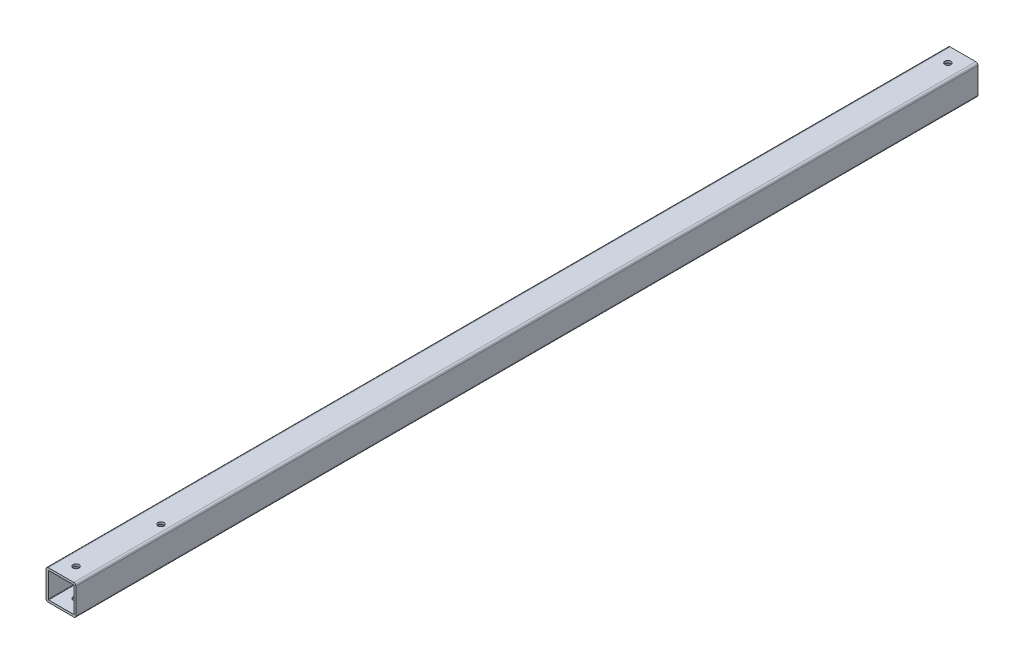
ISO-10303-21;
HEADER;
FILE_DESCRIPTION(('STEP AP214'),'2;1');
FILE_NAME('part.step','',(''),(''),'','','');
FILE_SCHEMA(('AUTOMOTIVE_DESIGN { 1 0 10303 214 1 1 1 1 }'));
ENDSEC;
DATA;
#1=APPLICATION_CONTEXT('core data for automotive mechanical design processes');
#2=APPLICATION_PROTOCOL_DEFINITION('international standard','automotive_design',2000,#1);
#3=PRODUCT_CONTEXT('',#1,'mechanical');
#4=PRODUCT('Part','Part','',(#3));
#5=PRODUCT_RELATED_PRODUCT_CATEGORY('part','',(#4));
#6=PRODUCT_DEFINITION_FORMATION('','',#4);
#7=PRODUCT_DEFINITION_CONTEXT('part definition',#1,'design');
#8=PRODUCT_DEFINITION('design','',#6,#7);
#9=PRODUCT_DEFINITION_SHAPE('','',#8);
#10=(LENGTH_UNIT() NAMED_UNIT(*) SI_UNIT(.MILLI.,.METRE.));
#11=(NAMED_UNIT(*) PLANE_ANGLE_UNIT() SI_UNIT($,.RADIAN.));
#12=(NAMED_UNIT(*) SI_UNIT($,.STERADIAN.) SOLID_ANGLE_UNIT());
#13=UNCERTAINTY_MEASURE_WITH_UNIT(LENGTH_MEASURE(1.E-05),#10,'distance_accuracy_value','');
#14=(GEOMETRIC_REPRESENTATION_CONTEXT(3) GLOBAL_UNCERTAINTY_ASSIGNED_CONTEXT((#13)) GLOBAL_UNIT_ASSIGNED_CONTEXT((#10,
#11,#12)) REPRESENTATION_CONTEXT('',''));
#15=CARTESIAN_POINT('',(0.,0.,0.));
#16=DIRECTION('',(0.,0.,1.));
#17=DIRECTION('',(1.,0.,0.));
#18=AXIS2_PLACEMENT_3D('',#15,#16,#17);
#19=CARTESIAN_POINT('',(0.,0.,1200.));
#20=DIRECTION('',(0.,0.,1.));
#21=DIRECTION('',(1.,0.,0.));
#22=AXIS2_PLACEMENT_3D('',#19,#20,#21);
#23=PLANE('',#22);
#24=DIRECTION('',(1.,0.,0.));
#25=VECTOR('',#24,1.);
#26=CARTESIAN_POINT('',(-20.,-20.,1200.));
#27=LINE('',#26,#25);
#28=CARTESIAN_POINT('',(-17.,-20.,1200.));
#29=VERTEX_POINT('',#28);
#30=CARTESIAN_POINT('',(17.,-20.,1200.));
#31=VERTEX_POINT('',#30);
#32=EDGE_CURVE('E211',#29,#31,#27,.T.);
#33=ORIENTED_EDGE('',*,*,#32,.T.);
#34=CARTESIAN_POINT('',(17.,-17.,1200.));
#35=DIRECTION('',(0.,0.,1.));
#36=DIRECTION('',(1.,0.,0.));
#37=AXIS2_PLACEMENT_3D('',#34,#35,#36);
#38=CIRCLE('',#37,3.);
#39=CARTESIAN_POINT('',(20.,-17.,1200.));
#40=VERTEX_POINT('',#39);
#41=EDGE_CURVE('E270',#31,#40,#38,.T.);
#42=ORIENTED_EDGE('',*,*,#41,.T.);
#43=DIRECTION('',(0.,1.,0.));
#44=VECTOR('',#43,1.);
#45=CARTESIAN_POINT('',(20.,20.,1200.));
#46=LINE('',#45,#44);
#47=CARTESIAN_POINT('',(20.,17.,1200.));
#48=VERTEX_POINT('',#47);
#49=EDGE_CURVE('E323',#40,#48,#46,.T.);
#50=ORIENTED_EDGE('',*,*,#49,.T.);
#51=CARTESIAN_POINT('',(17.,17.,1200.));
#52=DIRECTION('',(0.,0.,1.));
#53=DIRECTION('',(1.,0.,0.));
#54=AXIS2_PLACEMENT_3D('',#51,#52,#53);
#55=CIRCLE('',#54,3.);
#56=CARTESIAN_POINT('',(17.,20.,1200.));
#57=VERTEX_POINT('',#56);
#58=EDGE_CURVE('E266',#48,#57,#55,.T.);
#59=ORIENTED_EDGE('',*,*,#58,.T.);
#60=DIRECTION('',(-1.,0.,0.));
#61=VECTOR('',#60,1.);
#62=CARTESIAN_POINT('',(-20.,20.,1200.));
#63=LINE('',#62,#61);
#64=CARTESIAN_POINT('',(-17.,20.,1200.));
#65=VERTEX_POINT('',#64);
#66=EDGE_CURVE('E326',#57,#65,#63,.T.);
#67=ORIENTED_EDGE('',*,*,#66,.T.);
#68=CARTESIAN_POINT('',(-17.,17.,1200.));
#69=DIRECTION('',(0.,0.,1.));
#70=DIRECTION('',(1.,0.,0.));
#71=AXIS2_PLACEMENT_3D('',#68,#69,#70);
#72=CIRCLE('',#71,3.);
#73=CARTESIAN_POINT('',(-20.,17.,1200.));
#74=VERTEX_POINT('',#73);
#75=EDGE_CURVE('E92',#65,#74,#72,.T.);
#76=ORIENTED_EDGE('',*,*,#75,.T.);
#77=DIRECTION('',(0.,-1.,0.));
#78=VECTOR('',#77,1.);
#79=CARTESIAN_POINT('',(-20.,20.,1200.));
#80=LINE('',#79,#78);
#81=CARTESIAN_POINT('',(-20.,-17.,1200.));
#82=VERTEX_POINT('',#81);
#83=EDGE_CURVE('E216',#74,#82,#80,.T.);
#84=ORIENTED_EDGE('',*,*,#83,.T.);
#85=CARTESIAN_POINT('',(-17.,-17.,1200.));
#86=DIRECTION('',(0.,0.,1.));
#87=DIRECTION('',(1.,0.,0.));
#88=AXIS2_PLACEMENT_3D('',#85,#86,#87);
#89=CIRCLE('',#88,3.);
#90=EDGE_CURVE('E268',#82,#29,#89,.T.);
#91=ORIENTED_EDGE('',*,*,#90,.T.);
#92=EDGE_LOOP('',(#33,#42,#50,#59,#67,#76,#84,#91));
#93=FACE_BOUND('',#92,.T.);
#94=DIRECTION('',(-1.,0.,0.));
#95=VECTOR('',#94,1.);
#96=CARTESIAN_POINT('',(-20.,17.,1200.));
#97=LINE('',#96,#95);
#98=CARTESIAN_POINT('',(16.5,17.,1200.));
#99=VERTEX_POINT('',#98);
#100=CARTESIAN_POINT('',(-16.5,17.,1200.));
#101=VERTEX_POINT('',#100);
#102=EDGE_CURVE('E310',#99,#101,#97,.T.);
#103=ORIENTED_EDGE('',*,*,#102,.F.);
#104=CARTESIAN_POINT('',(16.5,16.5,1200.));
#105=DIRECTION('',(0.,0.,1.));
#106=DIRECTION('',(1.,0.,0.));
#107=AXIS2_PLACEMENT_3D('',#104,#105,#106);
#108=CIRCLE('',#107,0.5);
#109=CARTESIAN_POINT('',(17.,16.5,1200.));
#110=VERTEX_POINT('',#109);
#111=EDGE_CURVE('E241',#99,#110,#108,.F.);
#112=ORIENTED_EDGE('',*,*,#111,.T.);
#113=DIRECTION('',(0.,1.,0.));
#114=VECTOR('',#113,1.);
#115=CARTESIAN_POINT('',(17.,20.,1200.));
#116=LINE('',#115,#114);
#117=CARTESIAN_POINT('',(17.,-16.5,1200.));
#118=VERTEX_POINT('',#117);
#119=EDGE_CURVE('E307',#118,#110,#116,.T.);
#120=ORIENTED_EDGE('',*,*,#119,.F.);
#121=CARTESIAN_POINT('',(16.5,-16.5,1200.));
#122=DIRECTION('',(0.,0.,1.));
#123=DIRECTION('',(1.,0.,0.));
#124=AXIS2_PLACEMENT_3D('',#121,#122,#123);
#125=CIRCLE('',#124,0.5);
#126=CARTESIAN_POINT('',(16.5,-17.,1200.));
#127=VERTEX_POINT('',#126);
#128=EDGE_CURVE('E245',#118,#127,#125,.F.);
#129=ORIENTED_EDGE('',*,*,#128,.T.);
#130=DIRECTION('',(1.,0.,0.));
#131=VECTOR('',#130,1.);
#132=CARTESIAN_POINT('',(-20.,-17.,1200.));
#133=LINE('',#132,#131);
#134=CARTESIAN_POINT('',(-16.5,-17.,1200.));
#135=VERTEX_POINT('',#134);
#136=EDGE_CURVE('E315',#135,#127,#133,.T.);
#137=ORIENTED_EDGE('',*,*,#136,.F.);
#138=CARTESIAN_POINT('',(-16.5,-16.5,1200.));
#139=DIRECTION('',(0.,0.,1.));
#140=DIRECTION('',(1.,0.,0.));
#141=AXIS2_PLACEMENT_3D('',#138,#139,#140);
#142=CIRCLE('',#141,0.5);
#143=CARTESIAN_POINT('',(-17.,-16.5,1200.));
#144=VERTEX_POINT('',#143);
#145=EDGE_CURVE('E197',#135,#144,#142,.F.);
#146=ORIENTED_EDGE('',*,*,#145,.T.);
#147=DIRECTION('',(0.,-1.,0.));
#148=VECTOR('',#147,1.);
#149=CARTESIAN_POINT('',(-17.,20.,1200.));
#150=LINE('',#149,#148);
#151=CARTESIAN_POINT('',(-17.,16.5,1200.));
#152=VERTEX_POINT('',#151);
#153=EDGE_CURVE('E313',#152,#144,#150,.T.);
#154=ORIENTED_EDGE('',*,*,#153,.F.);
#155=CARTESIAN_POINT('',(-16.5,16.5,1200.));
#156=DIRECTION('',(0.,0.,1.));
#157=DIRECTION('',(1.,0.,0.));
#158=AXIS2_PLACEMENT_3D('',#155,#156,#157);
#159=CIRCLE('',#158,0.5);
#160=EDGE_CURVE('E196',#152,#101,#159,.F.);
#161=ORIENTED_EDGE('',*,*,#160,.T.);
#162=EDGE_LOOP('',(#103,#112,#120,#129,#137,#146,#154,#161));
#163=FACE_BOUND('',#162,.T.);
#164=ADVANCED_FACE('F68',(#93,#163),#23,.T.);
#165=CARTESIAN_POINT('',(0.,0.,0.));
#166=DIRECTION('',(0.,0.,1.));
#167=DIRECTION('',(1.,0.,0.));
#168=AXIS2_PLACEMENT_3D('',#165,#166,#167);
#169=PLANE('',#168);
#170=DIRECTION('',(0.,1.,0.));
#171=VECTOR('',#170,1.);
#172=CARTESIAN_POINT('',(20.,20.,0.));
#173=LINE('',#172,#171);
#174=CARTESIAN_POINT('',(20.,-17.,0.));
#175=VERTEX_POINT('',#174);
#176=CARTESIAN_POINT('',(20.,17.,0.));
#177=VERTEX_POINT('',#176);
#178=EDGE_CURVE('E318',#175,#177,#173,.T.);
#179=ORIENTED_EDGE('',*,*,#178,.F.);
#180=CARTESIAN_POINT('',(17.,-17.,0.));
#181=DIRECTION('',(0.,0.,1.));
#182=DIRECTION('',(1.,0.,0.));
#183=AXIS2_PLACEMENT_3D('',#180,#181,#182);
#184=CIRCLE('',#183,3.);
#185=CARTESIAN_POINT('',(17.,-20.,0.));
#186=VERTEX_POINT('',#185);
#187=EDGE_CURVE('E258',#175,#186,#184,.F.);
#188=ORIENTED_EDGE('',*,*,#187,.T.);
#189=DIRECTION('',(1.,0.,0.));
#190=VECTOR('',#189,1.);
#191=CARTESIAN_POINT('',(-20.,-20.,0.));
#192=LINE('',#191,#190);
#193=CARTESIAN_POINT('',(-17.,-20.,0.));
#194=VERTEX_POINT('',#193);
#195=EDGE_CURVE('E219',#194,#186,#192,.T.);
#196=ORIENTED_EDGE('',*,*,#195,.F.);
#197=CARTESIAN_POINT('',(-17.,-17.,0.));
#198=DIRECTION('',(0.,0.,1.));
#199=DIRECTION('',(1.,0.,0.));
#200=AXIS2_PLACEMENT_3D('',#197,#198,#199);
#201=CIRCLE('',#200,3.);
#202=CARTESIAN_POINT('',(-20.,-17.,0.));
#203=VERTEX_POINT('',#202);
#204=EDGE_CURVE('E256',#194,#203,#201,.F.);
#205=ORIENTED_EDGE('',*,*,#204,.T.);
#206=DIRECTION('',(0.,-1.,0.));
#207=VECTOR('',#206,1.);
#208=CARTESIAN_POINT('',(-20.,20.,0.));
#209=LINE('',#208,#207);
#210=CARTESIAN_POINT('',(-20.,17.,0.));
#211=VERTEX_POINT('',#210);
#212=EDGE_CURVE('E333',#211,#203,#209,.T.);
#213=ORIENTED_EDGE('',*,*,#212,.F.);
#214=CARTESIAN_POINT('',(-17.,17.,0.));
#215=DIRECTION('',(0.,0.,1.));
#216=DIRECTION('',(1.,0.,0.));
#217=AXIS2_PLACEMENT_3D('',#214,#215,#216);
#218=CIRCLE('',#217,3.);
#219=CARTESIAN_POINT('',(-17.,20.,0.));
#220=VERTEX_POINT('',#219);
#221=EDGE_CURVE('E252',#211,#220,#218,.F.);
#222=ORIENTED_EDGE('',*,*,#221,.T.);
#223=DIRECTION('',(-1.,0.,0.));
#224=VECTOR('',#223,1.);
#225=CARTESIAN_POINT('',(-20.,20.,0.));
#226=LINE('',#225,#224);
#227=CARTESIAN_POINT('',(17.,20.,0.));
#228=VERTEX_POINT('',#227);
#229=EDGE_CURVE('E331',#228,#220,#226,.T.);
#230=ORIENTED_EDGE('',*,*,#229,.F.);
#231=CARTESIAN_POINT('',(17.,17.,0.));
#232=DIRECTION('',(0.,0.,1.));
#233=DIRECTION('',(1.,0.,0.));
#234=AXIS2_PLACEMENT_3D('',#231,#232,#233);
#235=CIRCLE('',#234,3.);
#236=EDGE_CURVE('E254',#228,#177,#235,.F.);
#237=ORIENTED_EDGE('',*,*,#236,.T.);
#238=EDGE_LOOP('',(#179,#188,#196,#205,#213,#222,#230,#237));
#239=FACE_BOUND('',#238,.T.);
#240=DIRECTION('',(1.,0.,0.));
#241=VECTOR('',#240,1.);
#242=CARTESIAN_POINT('',(-20.,-17.,0.));
#243=LINE('',#242,#241);
#244=CARTESIAN_POINT('',(-16.5,-17.,0.));
#245=VERTEX_POINT('',#244);
#246=CARTESIAN_POINT('',(16.5,-17.,0.));
#247=VERTEX_POINT('',#246);
#248=EDGE_CURVE('E207',#245,#247,#243,.T.);
#249=ORIENTED_EDGE('',*,*,#248,.T.);
#250=CARTESIAN_POINT('',(16.5,-16.5,0.));
#251=DIRECTION('',(0.,0.,1.));
#252=DIRECTION('',(1.,0.,0.));
#253=AXIS2_PLACEMENT_3D('',#250,#251,#252);
#254=CIRCLE('',#253,0.5);
#255=CARTESIAN_POINT('',(17.,-16.5,0.));
#256=VERTEX_POINT('',#255);
#257=EDGE_CURVE('E243',#247,#256,#254,.T.);
#258=ORIENTED_EDGE('',*,*,#257,.T.);
#259=DIRECTION('',(0.,1.,0.));
#260=VECTOR('',#259,1.);
#261=CARTESIAN_POINT('',(17.,20.,0.));
#262=LINE('',#261,#260);
#263=CARTESIAN_POINT('',(17.,16.5,0.));
#264=VERTEX_POINT('',#263);
#265=EDGE_CURVE('E306',#256,#264,#262,.T.);
#266=ORIENTED_EDGE('',*,*,#265,.T.);
#267=CARTESIAN_POINT('',(16.5,16.5,0.));
#268=DIRECTION('',(0.,0.,1.));
#269=DIRECTION('',(1.,0.,0.));
#270=AXIS2_PLACEMENT_3D('',#267,#268,#269);
#271=CIRCLE('',#270,0.5);
#272=CARTESIAN_POINT('',(16.5,17.,0.));
#273=VERTEX_POINT('',#272);
#274=EDGE_CURVE('E239',#264,#273,#271,.T.);
#275=ORIENTED_EDGE('',*,*,#274,.T.);
#276=DIRECTION('',(-1.,0.,0.));
#277=VECTOR('',#276,1.);
#278=CARTESIAN_POINT('',(-20.,17.,0.));
#279=LINE('',#278,#277);
#280=CARTESIAN_POINT('',(-16.5,17.,0.));
#281=VERTEX_POINT('',#280);
#282=EDGE_CURVE('E191',#273,#281,#279,.T.);
#283=ORIENTED_EDGE('',*,*,#282,.T.);
#284=CARTESIAN_POINT('',(-16.5,16.5,0.));
#285=DIRECTION('',(0.,0.,1.));
#286=DIRECTION('',(1.,0.,0.));
#287=AXIS2_PLACEMENT_3D('',#284,#285,#286);
#288=CIRCLE('',#287,0.5);
#289=CARTESIAN_POINT('',(-17.,16.5,0.));
#290=VERTEX_POINT('',#289);
#291=EDGE_CURVE('E185',#281,#290,#288,.T.);
#292=ORIENTED_EDGE('',*,*,#291,.T.);
#293=DIRECTION('',(0.,-1.,0.));
#294=VECTOR('',#293,1.);
#295=CARTESIAN_POINT('',(-17.,20.,0.));
#296=LINE('',#295,#294);
#297=CARTESIAN_POINT('',(-17.,-16.5,0.));
#298=VERTEX_POINT('',#297);
#299=EDGE_CURVE('E189',#290,#298,#296,.T.);
#300=ORIENTED_EDGE('',*,*,#299,.T.);
#301=CARTESIAN_POINT('',(-16.5,-16.5,0.));
#302=DIRECTION('',(0.,0.,1.));
#303=DIRECTION('',(1.,0.,0.));
#304=AXIS2_PLACEMENT_3D('',#301,#302,#303);
#305=CIRCLE('',#304,0.5);
#306=EDGE_CURVE('E235',#298,#245,#305,.T.);
#307=ORIENTED_EDGE('',*,*,#306,.T.);
#308=EDGE_LOOP('',(#249,#258,#266,#275,#283,#292,#300,#307));
#309=FACE_BOUND('',#308,.T.);
#310=ADVANCED_FACE('F188',(#239,#309),#169,.F.);
#311=CARTESIAN_POINT('',(20.,20.,1200.));
#312=DIRECTION('',(-1.,0.,0.));
#313=DIRECTION('',(0.,-1.,0.));
#314=AXIS2_PLACEMENT_3D('',#311,#312,#313);
#315=PLANE('',#314);
#316=ORIENTED_EDGE('',*,*,#49,.F.);
#317=DIRECTION('',(0.,0.,-1.));
#318=VECTOR('',#317,1.);
#319=CARTESIAN_POINT('',(20.,-17.,1200.));
#320=LINE('',#319,#318);
#321=EDGE_CURVE('E249',#40,#175,#320,.T.);
#322=ORIENTED_EDGE('',*,*,#321,.T.);
#323=ORIENTED_EDGE('',*,*,#178,.T.);
#324=DIRECTION('',(0.,0.,-1.));
#325=VECTOR('',#324,1.);
#326=CARTESIAN_POINT('',(20.,17.,1200.));
#327=LINE('',#326,#325);
#328=EDGE_CURVE('E247',#177,#48,#327,.F.);
#329=ORIENTED_EDGE('',*,*,#328,.T.);
#330=EDGE_LOOP('',(#316,#322,#323,#329));
#331=FACE_BOUND('',#330,.T.);
#332=ADVANCED_FACE('F351',(#331),#315,.F.);
#333=CARTESIAN_POINT('',(-20.,20.,1200.));
#334=DIRECTION('',(0.,-1.,0.));
#335=DIRECTION('',(0.,0.,-1.));
#336=AXIS2_PLACEMENT_3D('',#333,#334,#335);
#337=PLANE('',#336);
#338=CARTESIAN_POINT('',(8.,20.,1075.));
#339=DIRECTION('',(0.,1.,0.));
#340=DIRECTION('',(0.,0.,1.));
#341=AXIS2_PLACEMENT_3D('',#338,#339,#340);
#342=CIRCLE('',#341,4.);
#343=CARTESIAN_POINT('',(8.,20.,1079.));
#344=VERTEX_POINT('',#343);
#345=EDGE_CURVE('E468',#344,#344,#342,.T.);
#346=ORIENTED_EDGE('',*,*,#345,.F.);
#347=EDGE_LOOP('',(#346));
#348=FACE_BOUND('',#347,.T.);
#349=CARTESIAN_POINT('',(0.,20.,20.));
#350=DIRECTION('',(0.,1.,0.));
#351=DIRECTION('',(0.,0.,1.));
#352=AXIS2_PLACEMENT_3D('',#349,#350,#351);
#353=CIRCLE('',#352,3.99999999999999);
#354=CARTESIAN_POINT('',(0.,20.,24.));
#355=VERTEX_POINT('',#354);
#356=EDGE_CURVE('E286',#355,#355,#353,.T.);
#357=ORIENTED_EDGE('',*,*,#356,.F.);
#358=EDGE_LOOP('',(#357));
#359=FACE_BOUND('',#358,.T.);
#360=CARTESIAN_POINT('',(1.44508322299388E-13,20.,1180.));
#361=DIRECTION('',(0.,1.,0.));
#362=DIRECTION('',(0.,0.,1.));
#363=AXIS2_PLACEMENT_3D('',#360,#361,#362);
#364=CIRCLE('',#363,3.99999999999999);
#365=CARTESIAN_POINT('',(1.44508322299388E-13,20.,1184.));
#366=VERTEX_POINT('',#365);
#367=EDGE_CURVE('E283',#366,#366,#364,.T.);
#368=ORIENTED_EDGE('',*,*,#367,.F.);
#369=EDGE_LOOP('',(#368));
#370=FACE_BOUND('',#369,.T.);
#371=ORIENTED_EDGE('',*,*,#66,.F.);
#372=DIRECTION('',(0.,0.,-1.));
#373=VECTOR('',#372,1.);
#374=CARTESIAN_POINT('',(17.,20.,1200.));
#375=LINE('',#374,#373);
#376=EDGE_CURVE('E14',#57,#228,#375,.T.);
#377=ORIENTED_EDGE('',*,*,#376,.T.);
#378=ORIENTED_EDGE('',*,*,#229,.T.);
#379=DIRECTION('',(0.,0.,-1.));
#380=VECTOR('',#379,1.);
#381=CARTESIAN_POINT('',(-17.,20.,1200.));
#382=LINE('',#381,#380);
#383=EDGE_CURVE('E77',#220,#65,#382,.F.);
#384=ORIENTED_EDGE('',*,*,#383,.T.);
#385=EDGE_LOOP('',(#371,#377,#378,#384));
#386=FACE_BOUND('',#385,.T.);
#387=ADVANCED_FACE('F359',(#348,#359,#370,#386),#337,.F.);
#388=CARTESIAN_POINT('',(-20.,20.,1200.));
#389=DIRECTION('',(1.,0.,0.));
#390=DIRECTION('',(0.,1.,0.));
#391=AXIS2_PLACEMENT_3D('',#388,#389,#390);
#392=PLANE('',#391);
#393=ORIENTED_EDGE('',*,*,#212,.T.);
#394=DIRECTION('',(0.,0.,-1.));
#395=VECTOR('',#394,1.);
#396=CARTESIAN_POINT('',(-20.,-17.,1200.));
#397=LINE('',#396,#395);
#398=EDGE_CURVE('E85',#203,#82,#397,.F.);
#399=ORIENTED_EDGE('',*,*,#398,.T.);
#400=ORIENTED_EDGE('',*,*,#83,.F.);
#401=DIRECTION('',(0.,0.,-1.));
#402=VECTOR('',#401,1.);
#403=CARTESIAN_POINT('',(-20.,17.,1200.));
#404=LINE('',#403,#402);
#405=EDGE_CURVE('E272',#74,#211,#404,.T.);
#406=ORIENTED_EDGE('',*,*,#405,.T.);
#407=EDGE_LOOP('',(#393,#399,#400,#406));
#408=FACE_BOUND('',#407,.T.);
#409=ADVANCED_FACE('F364',(#408),#392,.F.);
#410=CARTESIAN_POINT('',(-20.,-20.,1200.));
#411=DIRECTION('',(0.,1.,0.));
#412=DIRECTION('',(0.,0.,1.));
#413=AXIS2_PLACEMENT_3D('',#410,#411,#412);
#414=PLANE('',#413);
#415=CARTESIAN_POINT('',(8.,-20.,1075.));
#416=DIRECTION('',(0.,1.,0.));
#417=DIRECTION('',(0.,0.,1.));
#418=AXIS2_PLACEMENT_3D('',#415,#416,#417);
#419=CIRCLE('',#418,4.);
#420=CARTESIAN_POINT('',(8.,-20.,1079.));
#421=VERTEX_POINT('',#420);
#422=EDGE_CURVE('E467',#421,#421,#419,.T.);
#423=ORIENTED_EDGE('',*,*,#422,.T.);
#424=EDGE_LOOP('',(#423));
#425=FACE_BOUND('',#424,.T.);
#426=CARTESIAN_POINT('',(0.,-20.,20.));
#427=DIRECTION('',(0.,1.,0.));
#428=DIRECTION('',(0.,0.,1.));
#429=AXIS2_PLACEMENT_3D('',#426,#427,#428);
#430=CIRCLE('',#429,3.99999999999999);
#431=CARTESIAN_POINT('',(0.,-20.,24.));
#432=VERTEX_POINT('',#431);
#433=EDGE_CURVE('E279',#432,#432,#430,.T.);
#434=ORIENTED_EDGE('',*,*,#433,.T.);
#435=EDGE_LOOP('',(#434));
#436=FACE_BOUND('',#435,.T.);
#437=CARTESIAN_POINT('',(1.44508322299388E-13,-20.,1180.));
#438=DIRECTION('',(0.,1.,0.));
#439=DIRECTION('',(0.,0.,1.));
#440=AXIS2_PLACEMENT_3D('',#437,#438,#439);
#441=CIRCLE('',#440,3.99999999999999);
#442=CARTESIAN_POINT('',(1.44508322299388E-13,-20.,1184.));
#443=VERTEX_POINT('',#442);
#444=EDGE_CURVE('E297',#443,#443,#441,.T.);
#445=ORIENTED_EDGE('',*,*,#444,.T.);
#446=EDGE_LOOP('',(#445));
#447=FACE_BOUND('',#446,.T.);
#448=ORIENTED_EDGE('',*,*,#195,.T.);
#449=DIRECTION('',(0.,0.,-1.));
#450=VECTOR('',#449,1.);
#451=CARTESIAN_POINT('',(17.,-20.,1200.));
#452=LINE('',#451,#450);
#453=EDGE_CURVE('E263',#186,#31,#452,.F.);
#454=ORIENTED_EDGE('',*,*,#453,.T.);
#455=ORIENTED_EDGE('',*,*,#32,.F.);
#456=DIRECTION('',(0.,0.,-1.));
#457=VECTOR('',#456,1.);
#458=CARTESIAN_POINT('',(-17.,-20.,1200.));
#459=LINE('',#458,#457);
#460=EDGE_CURVE('E260',#29,#194,#459,.T.);
#461=ORIENTED_EDGE('',*,*,#460,.T.);
#462=EDGE_LOOP('',(#448,#454,#455,#461));
#463=FACE_BOUND('',#462,.T.);
#464=ADVANCED_FACE('F339',(#425,#436,#447,#463),#414,.F.);
#465=CARTESIAN_POINT('',(17.,20.,1200.));
#466=DIRECTION('',(-1.,0.,0.));
#467=DIRECTION('',(0.,-1.,0.));
#468=AXIS2_PLACEMENT_3D('',#465,#466,#467);
#469=PLANE('',#468);
#470=ORIENTED_EDGE('',*,*,#119,.T.);
#471=DIRECTION('',(0.,0.,-1.));
#472=VECTOR('',#471,1.);
#473=CARTESIAN_POINT('',(17.,16.5,0.));
#474=LINE('',#473,#472);
#475=EDGE_CURVE('E232',#110,#264,#474,.T.);
#476=ORIENTED_EDGE('',*,*,#475,.T.);
#477=ORIENTED_EDGE('',*,*,#265,.F.);
#478=DIRECTION('',(0.,0.,-1.));
#479=VECTOR('',#478,1.);
#480=CARTESIAN_POINT('',(17.,-16.5,1200.));
#481=LINE('',#480,#479);
#482=EDGE_CURVE('E230',#256,#118,#481,.F.);
#483=ORIENTED_EDGE('',*,*,#482,.T.);
#484=EDGE_LOOP('',(#470,#476,#477,#483));
#485=FACE_BOUND('',#484,.T.);
#486=ADVANCED_FACE('F383',(#485),#469,.T.);
#487=CARTESIAN_POINT('',(-20.,17.,1200.));
#488=DIRECTION('',(0.,-1.,0.));
#489=DIRECTION('',(0.,0.,-1.));
#490=AXIS2_PLACEMENT_3D('',#487,#488,#489);
#491=PLANE('',#490);
#492=CARTESIAN_POINT('',(8.,17.,1075.));
#493=DIRECTION('',(0.,-1.,0.));
#494=DIRECTION('',(0.,0.,-1.));
#495=AXIS2_PLACEMENT_3D('',#492,#493,#494);
#496=CIRCLE('',#495,4.);
#497=CARTESIAN_POINT('',(8.,17.,1071.));
#498=VERTEX_POINT('',#497);
#499=EDGE_CURVE('E291',#498,#498,#496,.T.);
#500=ORIENTED_EDGE('',*,*,#499,.F.);
#501=EDGE_LOOP('',(#500));
#502=FACE_BOUND('',#501,.T.);
#503=CARTESIAN_POINT('',(0.,17.,20.));
#504=DIRECTION('',(0.,-1.,0.));
#505=DIRECTION('',(0.,0.,-1.));
#506=AXIS2_PLACEMENT_3D('',#503,#504,#505);
#507=CIRCLE('',#506,3.99999999999999);
#508=CARTESIAN_POINT('',(0.,17.,16.));
#509=VERTEX_POINT('',#508);
#510=EDGE_CURVE('E278',#509,#509,#507,.T.);
#511=ORIENTED_EDGE('',*,*,#510,.F.);
#512=EDGE_LOOP('',(#511));
#513=FACE_BOUND('',#512,.T.);
#514=CARTESIAN_POINT('',(1.44508322299388E-13,17.,1180.));
#515=DIRECTION('',(0.,-1.,0.));
#516=DIRECTION('',(0.,0.,-1.));
#517=AXIS2_PLACEMENT_3D('',#514,#515,#516);
#518=CIRCLE('',#517,3.99999999999999);
#519=CARTESIAN_POINT('',(1.44508322299388E-13,17.,1176.));
#520=VERTEX_POINT('',#519);
#521=EDGE_CURVE('E300',#520,#520,#518,.T.);
#522=ORIENTED_EDGE('',*,*,#521,.F.);
#523=EDGE_LOOP('',(#522));
#524=FACE_BOUND('',#523,.T.);
#525=ORIENTED_EDGE('',*,*,#102,.T.);
#526=DIRECTION('',(0.,0.,-1.));
#527=VECTOR('',#526,1.);
#528=CARTESIAN_POINT('',(-16.5,17.,0.));
#529=LINE('',#528,#527);
#530=EDGE_CURVE('E228',#101,#281,#529,.T.);
#531=ORIENTED_EDGE('',*,*,#530,.T.);
#532=ORIENTED_EDGE('',*,*,#282,.F.);
#533=DIRECTION('',(0.,0.,-1.));
#534=VECTOR('',#533,1.);
#535=CARTESIAN_POINT('',(16.5,17.,1200.));
#536=LINE('',#535,#534);
#537=EDGE_CURVE('E226',#273,#99,#536,.F.);
#538=ORIENTED_EDGE('',*,*,#537,.T.);
#539=EDGE_LOOP('',(#525,#531,#532,#538));
#540=FACE_BOUND('',#539,.T.);
#541=ADVANCED_FACE('F423',(#502,#513,#524,#540),#491,.T.);
#542=CARTESIAN_POINT('',(-17.,20.,1200.));
#543=DIRECTION('',(1.,0.,0.));
#544=DIRECTION('',(0.,1.,0.));
#545=AXIS2_PLACEMENT_3D('',#542,#543,#544);
#546=PLANE('',#545);
#547=ORIENTED_EDGE('',*,*,#153,.T.);
#548=DIRECTION('',(0.,0.,-1.));
#549=VECTOR('',#548,1.);
#550=CARTESIAN_POINT('',(-17.,-16.5,0.));
#551=LINE('',#550,#549);
#552=EDGE_CURVE('E206',#144,#298,#551,.T.);
#553=ORIENTED_EDGE('',*,*,#552,.T.);
#554=ORIENTED_EDGE('',*,*,#299,.F.);
#555=DIRECTION('',(0.,0.,-1.));
#556=VECTOR('',#555,1.);
#557=CARTESIAN_POINT('',(-17.,16.5,1200.));
#558=LINE('',#557,#556);
#559=EDGE_CURVE('E203',#290,#152,#558,.F.);
#560=ORIENTED_EDGE('',*,*,#559,.T.);
#561=EDGE_LOOP('',(#547,#553,#554,#560));
#562=FACE_BOUND('',#561,.T.);
#563=ADVANCED_FACE('F202',(#562),#546,.T.);
#564=CARTESIAN_POINT('',(-20.,-17.,1200.));
#565=DIRECTION('',(0.,1.,0.));
#566=DIRECTION('',(0.,0.,1.));
#567=AXIS2_PLACEMENT_3D('',#564,#565,#566);
#568=PLANE('',#567);
#569=CARTESIAN_POINT('',(8.,-17.,1075.));
#570=DIRECTION('',(0.,1.,0.));
#571=DIRECTION('',(0.,0.,1.));
#572=AXIS2_PLACEMENT_3D('',#569,#570,#571);
#573=CIRCLE('',#572,4.);
#574=CARTESIAN_POINT('',(8.,-17.,1079.));
#575=VERTEX_POINT('',#574);
#576=EDGE_CURVE('E72',#575,#575,#573,.T.);
#577=ORIENTED_EDGE('',*,*,#576,.F.);
#578=EDGE_LOOP('',(#577));
#579=FACE_BOUND('',#578,.T.);
#580=CARTESIAN_POINT('',(0.,-17.,20.));
#581=DIRECTION('',(0.,1.,0.));
#582=DIRECTION('',(0.,0.,1.));
#583=AXIS2_PLACEMENT_3D('',#580,#581,#582);
#584=CIRCLE('',#583,3.99999999999999);
#585=CARTESIAN_POINT('',(0.,-17.,24.));
#586=VERTEX_POINT('',#585);
#587=EDGE_CURVE('E276',#586,#586,#584,.T.);
#588=ORIENTED_EDGE('',*,*,#587,.F.);
#589=EDGE_LOOP('',(#588));
#590=FACE_BOUND('',#589,.T.);
#591=CARTESIAN_POINT('',(1.44508322299388E-13,-17.,1180.));
#592=DIRECTION('',(0.,1.,0.));
#593=DIRECTION('',(0.,0.,1.));
#594=AXIS2_PLACEMENT_3D('',#591,#592,#593);
#595=CIRCLE('',#594,3.99999999999999);
#596=CARTESIAN_POINT('',(1.44508322299388E-13,-17.,1184.));
#597=VERTEX_POINT('',#596);
#598=EDGE_CURVE('E303',#597,#597,#595,.T.);
#599=ORIENTED_EDGE('',*,*,#598,.F.);
#600=EDGE_LOOP('',(#599));
#601=FACE_BOUND('',#600,.T.);
#602=ORIENTED_EDGE('',*,*,#248,.F.);
#603=DIRECTION('',(0.,0.,-1.));
#604=VECTOR('',#603,1.);
#605=CARTESIAN_POINT('',(-16.5,-17.,1200.));
#606=LINE('',#605,#604);
#607=EDGE_CURVE('E224',#245,#135,#606,.F.);
#608=ORIENTED_EDGE('',*,*,#607,.T.);
#609=ORIENTED_EDGE('',*,*,#136,.T.);
#610=DIRECTION('',(0.,0.,-1.));
#611=VECTOR('',#610,1.);
#612=CARTESIAN_POINT('',(16.5,-17.,0.));
#613=LINE('',#612,#611);
#614=EDGE_CURVE('E213',#127,#247,#613,.T.);
#615=ORIENTED_EDGE('',*,*,#614,.T.);
#616=EDGE_LOOP('',(#602,#608,#609,#615));
#617=FACE_BOUND('',#616,.T.);
#618=ADVANCED_FACE('F399',(#579,#590,#601,#617),#568,.T.);
#619=CARTESIAN_POINT('',(-16.5,-16.5,1200.));
#620=DIRECTION('',(0.,0.,1.));
#621=DIRECTION('',(1.,0.,0.));
#622=AXIS2_PLACEMENT_3D('',#619,#620,#621);
#623=CYLINDRICAL_SURFACE('',#622,0.5);
#624=ORIENTED_EDGE('',*,*,#145,.F.);
#625=ORIENTED_EDGE('',*,*,#607,.F.);
#626=ORIENTED_EDGE('',*,*,#306,.F.);
#627=ORIENTED_EDGE('',*,*,#552,.F.);
#628=EDGE_LOOP('',(#624,#625,#626,#627));
#629=FACE_BOUND('',#628,.T.);
#630=ADVANCED_FACE('F396',(#629),#623,.F.);
#631=CARTESIAN_POINT('',(-16.5,16.5,1200.));
#632=DIRECTION('',(0.,0.,1.));
#633=DIRECTION('',(1.,0.,0.));
#634=AXIS2_PLACEMENT_3D('',#631,#632,#633);
#635=CYLINDRICAL_SURFACE('',#634,0.5);
#636=ORIENTED_EDGE('',*,*,#160,.F.);
#637=ORIENTED_EDGE('',*,*,#559,.F.);
#638=ORIENTED_EDGE('',*,*,#291,.F.);
#639=ORIENTED_EDGE('',*,*,#530,.F.);
#640=EDGE_LOOP('',(#636,#637,#638,#639));
#641=FACE_BOUND('',#640,.T.);
#642=ADVANCED_FACE('F210',(#641),#635,.F.);
#643=CARTESIAN_POINT('',(16.5,16.5,1200.));
#644=DIRECTION('',(0.,0.,1.));
#645=DIRECTION('',(1.,0.,0.));
#646=AXIS2_PLACEMENT_3D('',#643,#644,#645);
#647=CYLINDRICAL_SURFACE('',#646,0.5);
#648=ORIENTED_EDGE('',*,*,#111,.F.);
#649=ORIENTED_EDGE('',*,*,#537,.F.);
#650=ORIENTED_EDGE('',*,*,#274,.F.);
#651=ORIENTED_EDGE('',*,*,#475,.F.);
#652=EDGE_LOOP('',(#648,#649,#650,#651));
#653=FACE_BOUND('',#652,.T.);
#654=ADVANCED_FACE('F403',(#653),#647,.F.);
#655=CARTESIAN_POINT('',(16.5,-16.5,1200.));
#656=DIRECTION('',(0.,0.,1.));
#657=DIRECTION('',(1.,0.,0.));
#658=AXIS2_PLACEMENT_3D('',#655,#656,#657);
#659=CYLINDRICAL_SURFACE('',#658,0.5);
#660=ORIENTED_EDGE('',*,*,#128,.F.);
#661=ORIENTED_EDGE('',*,*,#482,.F.);
#662=ORIENTED_EDGE('',*,*,#257,.F.);
#663=ORIENTED_EDGE('',*,*,#614,.F.);
#664=EDGE_LOOP('',(#660,#661,#662,#663));
#665=FACE_BOUND('',#664,.T.);
#666=ADVANCED_FACE('F374',(#665),#659,.F.);
#667=CARTESIAN_POINT('',(17.,-17.,1200.));
#668=DIRECTION('',(0.,0.,-1.));
#669=DIRECTION('',(-1.,0.,0.));
#670=AXIS2_PLACEMENT_3D('',#667,#668,#669);
#671=CYLINDRICAL_SURFACE('',#670,3.);
#672=ORIENTED_EDGE('',*,*,#41,.F.);
#673=ORIENTED_EDGE('',*,*,#453,.F.);
#674=ORIENTED_EDGE('',*,*,#187,.F.);
#675=ORIENTED_EDGE('',*,*,#321,.F.);
#676=EDGE_LOOP('',(#672,#673,#674,#675));
#677=FACE_BOUND('',#676,.T.);
#678=ADVANCED_FACE('F345',(#677),#671,.T.);
#679=CARTESIAN_POINT('',(-17.,-17.,1200.));
#680=DIRECTION('',(0.,0.,-1.));
#681=DIRECTION('',(-1.,0.,0.));
#682=AXIS2_PLACEMENT_3D('',#679,#680,#681);
#683=CYLINDRICAL_SURFACE('',#682,3.);
#684=ORIENTED_EDGE('',*,*,#90,.F.);
#685=ORIENTED_EDGE('',*,*,#398,.F.);
#686=ORIENTED_EDGE('',*,*,#204,.F.);
#687=ORIENTED_EDGE('',*,*,#460,.F.);
#688=EDGE_LOOP('',(#684,#685,#686,#687));
#689=FACE_BOUND('',#688,.T.);
#690=ADVANCED_FACE('F367',(#689),#683,.T.);
#691=CARTESIAN_POINT('',(17.,17.,1200.));
#692=DIRECTION('',(0.,0.,-1.));
#693=DIRECTION('',(-1.,0.,0.));
#694=AXIS2_PLACEMENT_3D('',#691,#692,#693);
#695=CYLINDRICAL_SURFACE('',#694,3.);
#696=ORIENTED_EDGE('',*,*,#58,.F.);
#697=ORIENTED_EDGE('',*,*,#328,.F.);
#698=ORIENTED_EDGE('',*,*,#236,.F.);
#699=ORIENTED_EDGE('',*,*,#376,.F.);
#700=EDGE_LOOP('',(#696,#697,#698,#699));
#701=FACE_BOUND('',#700,.T.);
#702=ADVANCED_FACE('F355',(#701),#695,.T.);
#703=CARTESIAN_POINT('',(-17.,17.,1200.));
#704=DIRECTION('',(0.,0.,-1.));
#705=DIRECTION('',(-1.,0.,0.));
#706=AXIS2_PLACEMENT_3D('',#703,#704,#705);
#707=CYLINDRICAL_SURFACE('',#706,3.);
#708=ORIENTED_EDGE('',*,*,#75,.F.);
#709=ORIENTED_EDGE('',*,*,#383,.F.);
#710=ORIENTED_EDGE('',*,*,#221,.F.);
#711=ORIENTED_EDGE('',*,*,#405,.F.);
#712=EDGE_LOOP('',(#708,#709,#710,#711));
#713=FACE_BOUND('',#712,.T.);
#714=ADVANCED_FACE('F70',(#713),#707,.T.);
#715=CARTESIAN_POINT('',(1.44508322299388E-13,20.,1180.));
#716=DIRECTION('',(0.,1.,0.));
#717=DIRECTION('',(0.,0.,1.));
#718=AXIS2_PLACEMENT_3D('',#715,#716,#717);
#719=CYLINDRICAL_SURFACE('',#718,3.99999999999999);
#720=ORIENTED_EDGE('',*,*,#521,.T.);
#721=EDGE_LOOP('',(#720));
#722=FACE_BOUND('',#721,.T.);
#723=ORIENTED_EDGE('',*,*,#367,.T.);
#724=EDGE_LOOP('',(#723));
#725=FACE_BOUND('',#724,.T.);
#726=ADVANCED_FACE('F443',(#722,#725),#719,.F.);
#727=ORIENTED_EDGE('',*,*,#598,.T.);
#728=EDGE_LOOP('',(#727));
#729=FACE_BOUND('',#728,.T.);
#730=ORIENTED_EDGE('',*,*,#444,.F.);
#731=EDGE_LOOP('',(#730));
#732=FACE_BOUND('',#731,.T.);
#733=ADVANCED_FACE('F446',(#729,#732),#719,.F.);
#734=CARTESIAN_POINT('',(0.,20.,20.));
#735=DIRECTION('',(0.,1.,0.));
#736=DIRECTION('',(0.,0.,1.));
#737=AXIS2_PLACEMENT_3D('',#734,#735,#736);
#738=CYLINDRICAL_SURFACE('',#737,3.99999999999999);
#739=ORIENTED_EDGE('',*,*,#587,.T.);
#740=EDGE_LOOP('',(#739));
#741=FACE_BOUND('',#740,.T.);
#742=ORIENTED_EDGE('',*,*,#433,.F.);
#743=EDGE_LOOP('',(#742));
#744=FACE_BOUND('',#743,.T.);
#745=ADVANCED_FACE('F448',(#741,#744),#738,.F.);
#746=ORIENTED_EDGE('',*,*,#510,.T.);
#747=EDGE_LOOP('',(#746));
#748=FACE_BOUND('',#747,.T.);
#749=ORIENTED_EDGE('',*,*,#356,.T.);
#750=EDGE_LOOP('',(#749));
#751=FACE_BOUND('',#750,.T.);
#752=ADVANCED_FACE('F451',(#748,#751),#738,.F.);
#753=CARTESIAN_POINT('',(8.,-20.,1075.));
#754=DIRECTION('',(0.,1.,0.));
#755=DIRECTION('',(0.,0.,1.));
#756=AXIS2_PLACEMENT_3D('',#753,#754,#755);
#757=CYLINDRICAL_SURFACE('',#756,4.);
#758=ORIENTED_EDGE('',*,*,#576,.T.);
#759=EDGE_LOOP('',(#758));
#760=FACE_BOUND('',#759,.T.);
#761=ORIENTED_EDGE('',*,*,#422,.F.);
#762=EDGE_LOOP('',(#761));
#763=FACE_BOUND('',#762,.T.);
#764=ADVANCED_FACE('F452',(#760,#763),#757,.F.);
#765=ORIENTED_EDGE('',*,*,#499,.T.);
#766=EDGE_LOOP('',(#765));
#767=FACE_BOUND('',#766,.T.);
#768=ORIENTED_EDGE('',*,*,#345,.T.);
#769=EDGE_LOOP('',(#768));
#770=FACE_BOUND('',#769,.T.);
#771=ADVANCED_FACE('F454',(#767,#770),#757,.F.);
#772=CLOSED_SHELL('',(#164,#310,#332,#387,#409,#464,#486,#541,#563,#618,#630,#642,#654,#666,
#678,#690,#702,#714,#726,#733,#745,#752,#764,#771));
#773=MANIFOLD_SOLID_BREP('B2',#772);
#774=ADVANCED_BREP_SHAPE_REPRESENTATION('',(#18,#773),#14);
#775=SHAPE_DEFINITION_REPRESENTATION(#9,#774);
ENDSEC;
END-ISO-10303-21;
